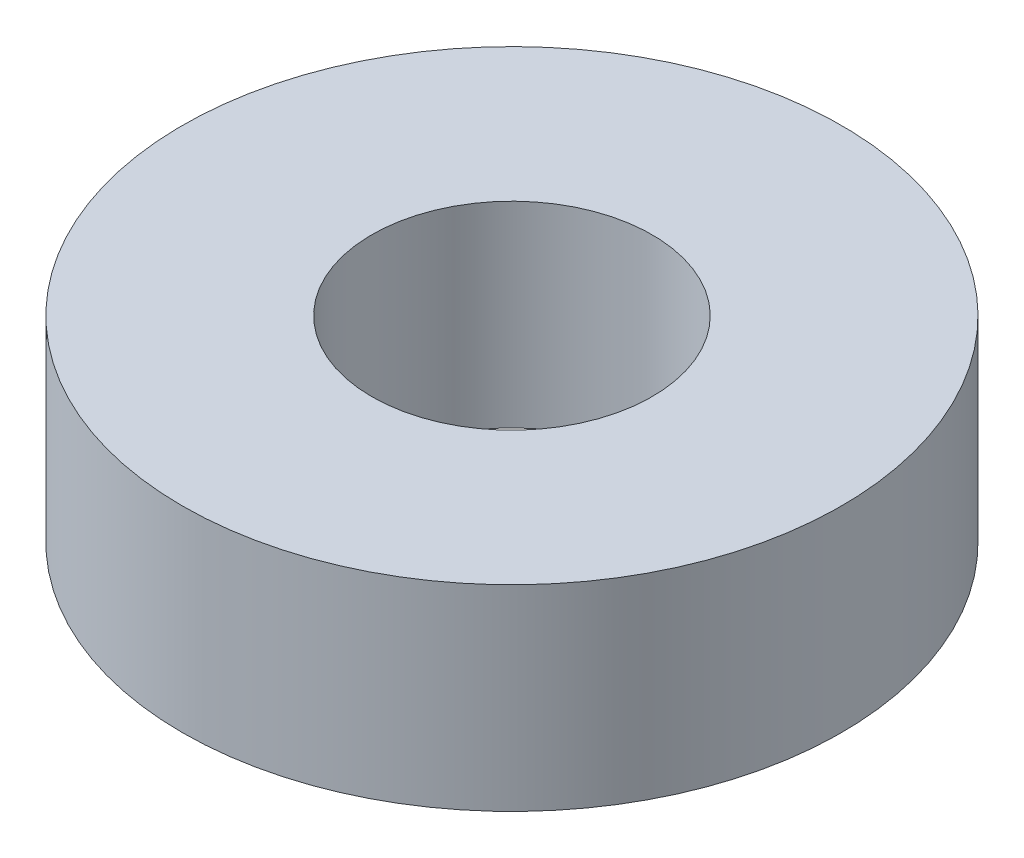
ISO-10303-21;
HEADER;
FILE_DESCRIPTION(('STEP AP214'),'2;1');
FILE_NAME('part.step','',(''),(''),'','','');
FILE_SCHEMA(('AUTOMOTIVE_DESIGN { 1 0 10303 214 1 1 1 1 }'));
ENDSEC;
DATA;
#1=APPLICATION_CONTEXT('core data for automotive mechanical design processes');
#2=APPLICATION_PROTOCOL_DEFINITION('international standard','automotive_design',2000,#1);
#3=PRODUCT_CONTEXT('',#1,'mechanical');
#4=PRODUCT('Part','Part','',(#3));
#5=PRODUCT_RELATED_PRODUCT_CATEGORY('part','',(#4));
#6=PRODUCT_DEFINITION_FORMATION('','',#4);
#7=PRODUCT_DEFINITION_CONTEXT('part definition',#1,'design');
#8=PRODUCT_DEFINITION('design','',#6,#7);
#9=PRODUCT_DEFINITION_SHAPE('','',#8);
#10=(LENGTH_UNIT() NAMED_UNIT(*) SI_UNIT(.MILLI.,.METRE.));
#11=(NAMED_UNIT(*) PLANE_ANGLE_UNIT() SI_UNIT($,.RADIAN.));
#12=(NAMED_UNIT(*) SI_UNIT($,.STERADIAN.) SOLID_ANGLE_UNIT());
#13=UNCERTAINTY_MEASURE_WITH_UNIT(LENGTH_MEASURE(1.E-05),#10,'distance_accuracy_value','');
#14=(GEOMETRIC_REPRESENTATION_CONTEXT(3) GLOBAL_UNCERTAINTY_ASSIGNED_CONTEXT((#13)) GLOBAL_UNIT_ASSIGNED_CONTEXT((#10,
#11,#12)) REPRESENTATION_CONTEXT('',''));
#15=CARTESIAN_POINT('',(0.,0.,0.));
#16=DIRECTION('',(0.,0.,1.));
#17=DIRECTION('',(1.,0.,0.));
#18=AXIS2_PLACEMENT_3D('',#15,#16,#17);
#19=CARTESIAN_POINT('',(0.,14.,0.));
#20=DIRECTION('',(0.,1.,0.));
#21=DIRECTION('',(0.,0.,1.));
#22=AXIS2_PLACEMENT_3D('',#19,#20,#21);
#23=PLANE('',#22);
#24=CARTESIAN_POINT('',(0.,14.,0.));
#25=DIRECTION('',(0.,1.,0.));
#26=DIRECTION('',(0.,0.,1.));
#27=AXIS2_PLACEMENT_3D('',#24,#25,#26);
#28=CIRCLE('',#27,23.5);
#29=CARTESIAN_POINT('',(0.,14.,23.5));
#30=VERTEX_POINT('',#29);
#31=EDGE_CURVE('E10',#30,#30,#28,.T.);
#32=ORIENTED_EDGE('',*,*,#31,.T.);
#33=EDGE_LOOP('',(#32));
#34=FACE_BOUND('',#33,.T.);
#35=CARTESIAN_POINT('',(0.,14.,0.));
#36=DIRECTION('',(0.,1.,0.));
#37=DIRECTION('',(0.,0.,1.));
#38=AXIS2_PLACEMENT_3D('',#35,#36,#37);
#39=CIRCLE('',#38,10.);
#40=CARTESIAN_POINT('',(0.,14.,10.));
#41=VERTEX_POINT('',#40);
#42=EDGE_CURVE('E41',#41,#41,#39,.T.);
#43=ORIENTED_EDGE('',*,*,#42,.F.);
#44=EDGE_LOOP('',(#43));
#45=FACE_BOUND('',#44,.T.);
#46=ADVANCED_FACE('F30',(#34,#45),#23,.T.);
#47=CARTESIAN_POINT('',(0.,0.,0.));
#48=DIRECTION('',(0.,1.,0.));
#49=DIRECTION('',(0.,0.,1.));
#50=AXIS2_PLACEMENT_3D('',#47,#48,#49);
#51=PLANE('',#50);
#52=CARTESIAN_POINT('',(0.,0.,0.));
#53=DIRECTION('',(0.,1.,0.));
#54=DIRECTION('',(0.,0.,1.));
#55=AXIS2_PLACEMENT_3D('',#52,#53,#54);
#56=CIRCLE('',#55,23.5);
#57=CARTESIAN_POINT('',(0.,0.,23.5));
#58=VERTEX_POINT('',#57);
#59=EDGE_CURVE('E34',#58,#58,#56,.T.);
#60=ORIENTED_EDGE('',*,*,#59,.F.);
#61=EDGE_LOOP('',(#60));
#62=FACE_BOUND('',#61,.T.);
#63=CARTESIAN_POINT('',(0.,0.,0.));
#64=DIRECTION('',(0.,1.,0.));
#65=DIRECTION('',(0.,0.,1.));
#66=AXIS2_PLACEMENT_3D('',#63,#64,#65);
#67=CIRCLE('',#66,10.);
#68=CARTESIAN_POINT('',(0.,0.,10.));
#69=VERTEX_POINT('',#68);
#70=EDGE_CURVE('E43',#69,#69,#67,.T.);
#71=ORIENTED_EDGE('',*,*,#70,.T.);
#72=EDGE_LOOP('',(#71));
#73=FACE_BOUND('',#72,.T.);
#74=ADVANCED_FACE('F53',(#62,#73),#51,.F.);
#75=CARTESIAN_POINT('',(0.,14.,0.));
#76=DIRECTION('',(0.,-1.,0.));
#77=DIRECTION('',(0.,0.,-1.));
#78=AXIS2_PLACEMENT_3D('',#75,#76,#77);
#79=CYLINDRICAL_SURFACE('',#78,23.5);
#80=ORIENTED_EDGE('',*,*,#31,.F.);
#81=EDGE_LOOP('',(#80));
#82=FACE_BOUND('',#81,.T.);
#83=ORIENTED_EDGE('',*,*,#59,.T.);
#84=EDGE_LOOP('',(#83));
#85=FACE_BOUND('',#84,.T.);
#86=ADVANCED_FACE('F32',(#82,#85),#79,.T.);
#87=CARTESIAN_POINT('',(0.,14.,0.));
#88=DIRECTION('',(0.,-1.,0.));
#89=DIRECTION('',(0.,0.,-1.));
#90=AXIS2_PLACEMENT_3D('',#87,#88,#89);
#91=CYLINDRICAL_SURFACE('',#90,10.);
#92=ORIENTED_EDGE('',*,*,#42,.T.);
#93=EDGE_LOOP('',(#92));
#94=FACE_BOUND('',#93,.T.);
#95=ORIENTED_EDGE('',*,*,#70,.F.);
#96=EDGE_LOOP('',(#95));
#97=FACE_BOUND('',#96,.T.);
#98=ADVANCED_FACE('F49',(#94,#97),#91,.F.);
#99=CLOSED_SHELL('',(#46,#74,#86,#98));
#100=MANIFOLD_SOLID_BREP('B2',#99);
#101=ADVANCED_BREP_SHAPE_REPRESENTATION('',(#18,#100),#14);
#102=SHAPE_DEFINITION_REPRESENTATION(#9,#101);
ENDSEC;
END-ISO-10303-21;
